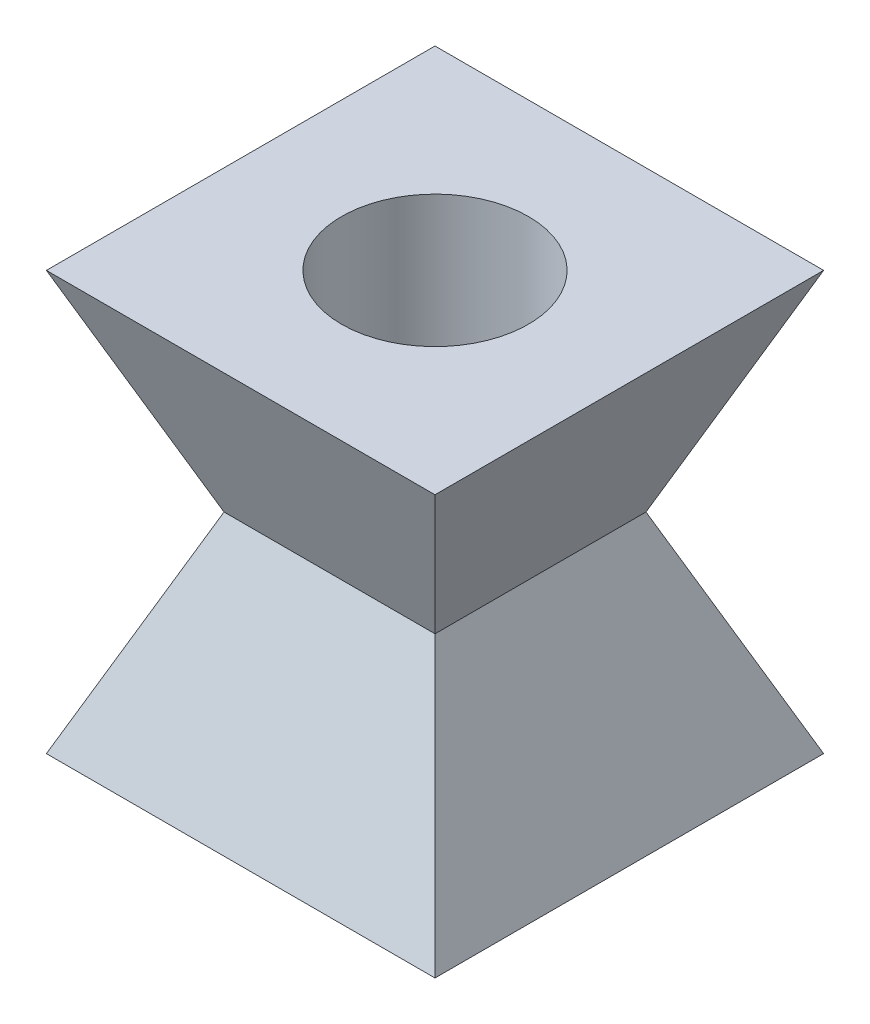
ISO-10303-21;
HEADER;
FILE_DESCRIPTION(('STEP AP214'),'2;1');
FILE_NAME('part.step','',(''),(''),'','','');
FILE_SCHEMA(('AUTOMOTIVE_DESIGN { 1 0 10303 214 1 1 1 1 }'));
ENDSEC;
DATA;
#1=APPLICATION_CONTEXT('core data for automotive mechanical design processes');
#2=APPLICATION_PROTOCOL_DEFINITION('international standard','automotive_design',2000,#1);
#3=PRODUCT_CONTEXT('',#1,'mechanical');
#4=PRODUCT('Part','Part','',(#3));
#5=PRODUCT_RELATED_PRODUCT_CATEGORY('part','',(#4));
#6=PRODUCT_DEFINITION_FORMATION('','',#4);
#7=PRODUCT_DEFINITION_CONTEXT('part definition',#1,'design');
#8=PRODUCT_DEFINITION('design','',#6,#7);
#9=PRODUCT_DEFINITION_SHAPE('','',#8);
#10=(LENGTH_UNIT() NAMED_UNIT(*) SI_UNIT(.MILLI.,.METRE.));
#11=(NAMED_UNIT(*) PLANE_ANGLE_UNIT() SI_UNIT($,.RADIAN.));
#12=(NAMED_UNIT(*) SI_UNIT($,.STERADIAN.) SOLID_ANGLE_UNIT());
#13=UNCERTAINTY_MEASURE_WITH_UNIT(LENGTH_MEASURE(1.E-05),#10,'distance_accuracy_value','');
#14=(GEOMETRIC_REPRESENTATION_CONTEXT(3) GLOBAL_UNCERTAINTY_ASSIGNED_CONTEXT((#13)) GLOBAL_UNIT_ASSIGNED_CONTEXT((#10,
#11,#12)) REPRESENTATION_CONTEXT('',''));
#15=CARTESIAN_POINT('',(0.,0.,0.));
#16=DIRECTION('',(0.,0.,1.));
#17=DIRECTION('',(1.,0.,0.));
#18=AXIS2_PLACEMENT_3D('',#15,#16,#17);
#19=CARTESIAN_POINT('',(52.,0.,-52.));
#20=DIRECTION('',(0.92050485345244,-0.390731128489275,0.));
#21=DIRECTION('',(0.390731128489275,0.92050485345244,0.));
#22=AXIS2_PLACEMENT_3D('',#19,#20,#21);
#23=PLANE('',#22);
#24=DIRECTION('',(0.,0.,-1.));
#25=VECTOR('',#24,1.);
#26=CARTESIAN_POINT('',(52.,0.,-52.));
#27=LINE('',#26,#25);
#28=CARTESIAN_POINT('',(52.,0.,52.));
#29=VERTEX_POINT('',#28);
#30=CARTESIAN_POINT('',(52.,0.,-52.));
#31=VERTEX_POINT('',#30);
#32=EDGE_CURVE('E140',#29,#31,#27,.T.);
#33=ORIENTED_EDGE('',*,*,#32,.F.);
#34=DIRECTION('',(0.363936289648103,0.8573801689766,0.363936289648103));
#35=VECTOR('',#34,1.);
#36=CARTESIAN_POINT('',(38.2252392160259,-32.4513027815816,38.2252392160258));
#37=LINE('',#36,#35);
#38=CARTESIAN_POINT('',(28.2294102922621,-56.,28.229410292262));
#39=VERTEX_POINT('',#38);
#40=EDGE_CURVE('E11',#39,#29,#37,.T.);
#41=ORIENTED_EDGE('',*,*,#40,.F.);
#42=DIRECTION('',(0.,0.,-1.));
#43=VECTOR('',#42,1.);
#44=CARTESIAN_POINT('',(28.2294102922621,-56.,0.));
#45=LINE('',#44,#43);
#46=CARTESIAN_POINT('',(28.229410292262,-56.,-28.2294102922621));
#47=VERTEX_POINT('',#46);
#48=EDGE_CURVE('E119',#39,#47,#45,.T.);
#49=ORIENTED_EDGE('',*,*,#48,.T.);
#50=DIRECTION('',(0.363936289648103,0.8573801689766,-0.363936289648103));
#51=VECTOR('',#50,1.);
#52=CARTESIAN_POINT('',(52.,0.,-52.));
#53=LINE('',#52,#51);
#54=EDGE_CURVE('E162',#47,#31,#53,.T.);
#55=ORIENTED_EDGE('',*,*,#54,.T.);
#56=EDGE_LOOP('',(#33,#41,#49,#55));
#57=FACE_BOUND('',#56,.T.);
#58=ADVANCED_FACE('F43',(#57),#23,.T.);
#59=CARTESIAN_POINT('',(-52.,0.,52.));
#60=DIRECTION('',(0.,-0.390731128489275,0.92050485345244));
#61=DIRECTION('',(0.,-0.92050485345244,-0.390731128489275));
#62=AXIS2_PLACEMENT_3D('',#59,#60,#61);
#63=PLANE('',#62);
#64=DIRECTION('',(1.,0.,0.));
#65=VECTOR('',#64,1.);
#66=CARTESIAN_POINT('',(-52.,0.,52.));
#67=LINE('',#66,#65);
#68=CARTESIAN_POINT('',(-52.,0.,52.));
#69=VERTEX_POINT('',#68);
#70=EDGE_CURVE('E158',#69,#29,#67,.T.);
#71=ORIENTED_EDGE('',*,*,#70,.F.);
#72=DIRECTION('',(-0.363936289648103,0.8573801689766,0.363936289648103));
#73=VECTOR('',#72,1.);
#74=CARTESIAN_POINT('',(-38.2252392160259,-32.4513027815816,38.2252392160259));
#75=LINE('',#74,#73);
#76=CARTESIAN_POINT('',(-28.2294102922621,-56.,28.229410292262));
#77=VERTEX_POINT('',#76);
#78=EDGE_CURVE('E53',#77,#69,#75,.T.);
#79=ORIENTED_EDGE('',*,*,#78,.F.);
#80=DIRECTION('',(1.,0.,0.));
#81=VECTOR('',#80,1.);
#82=CARTESIAN_POINT('',(0.,-56.,28.229410292262));
#83=LINE('',#82,#81);
#84=EDGE_CURVE('E166',#77,#39,#83,.T.);
#85=ORIENTED_EDGE('',*,*,#84,.T.);
#86=ORIENTED_EDGE('',*,*,#40,.T.);
#87=EDGE_LOOP('',(#71,#79,#85,#86));
#88=FACE_BOUND('',#87,.T.);
#89=ADVANCED_FACE('F45',(#88),#63,.T.);
#90=CARTESIAN_POINT('',(-52.,0.,-52.));
#91=DIRECTION('',(-0.92050485345244,-0.390731128489275,0.));
#92=DIRECTION('',(0.390731128489275,-0.92050485345244,0.));
#93=AXIS2_PLACEMENT_3D('',#90,#91,#92);
#94=PLANE('',#93);
#95=DIRECTION('',(0.,0.,1.));
#96=VECTOR('',#95,1.);
#97=CARTESIAN_POINT('',(-52.,0.,-52.));
#98=LINE('',#97,#96);
#99=CARTESIAN_POINT('',(-52.,0.,-52.));
#100=VERTEX_POINT('',#99);
#101=EDGE_CURVE('E154',#100,#69,#98,.T.);
#102=ORIENTED_EDGE('',*,*,#101,.F.);
#103=DIRECTION('',(-0.363936289648103,0.8573801689766,-0.363936289648103));
#104=VECTOR('',#103,1.);
#105=CARTESIAN_POINT('',(-52.,0.,-52.));
#106=LINE('',#105,#104);
#107=CARTESIAN_POINT('',(-28.2294102922621,-56.,-28.2294102922621));
#108=VERTEX_POINT('',#107);
#109=EDGE_CURVE('E165',#108,#100,#106,.T.);
#110=ORIENTED_EDGE('',*,*,#109,.F.);
#111=DIRECTION('',(0.,0.,1.));
#112=VECTOR('',#111,1.);
#113=CARTESIAN_POINT('',(-28.2294102922621,-56.,0.));
#114=LINE('',#113,#112);
#115=EDGE_CURVE('E61',#108,#77,#114,.T.);
#116=ORIENTED_EDGE('',*,*,#115,.T.);
#117=ORIENTED_EDGE('',*,*,#78,.T.);
#118=EDGE_LOOP('',(#102,#110,#116,#117));
#119=FACE_BOUND('',#118,.T.);
#120=ADVANCED_FACE('F186',(#119),#94,.T.);
#121=CARTESIAN_POINT('',(-52.,0.,-52.));
#122=DIRECTION('',(0.,-0.390731128489275,-0.92050485345244));
#123=DIRECTION('',(0.,0.92050485345244,-0.390731128489275));
#124=AXIS2_PLACEMENT_3D('',#121,#122,#123);
#125=PLANE('',#124);
#126=DIRECTION('',(-1.,0.,0.));
#127=VECTOR('',#126,1.);
#128=CARTESIAN_POINT('',(-52.,0.,-52.));
#129=LINE('',#128,#127);
#130=EDGE_CURVE('E150',#31,#100,#129,.T.);
#131=ORIENTED_EDGE('',*,*,#130,.F.);
#132=ORIENTED_EDGE('',*,*,#54,.F.);
#133=DIRECTION('',(-1.,0.,0.));
#134=VECTOR('',#133,1.);
#135=CARTESIAN_POINT('',(0.,-56.,-28.2294102922621));
#136=LINE('',#135,#134);
#137=EDGE_CURVE('E47',#47,#108,#136,.T.);
#138=ORIENTED_EDGE('',*,*,#137,.T.);
#139=ORIENTED_EDGE('',*,*,#109,.T.);
#140=EDGE_LOOP('',(#131,#132,#138,#139));
#141=FACE_BOUND('',#140,.T.);
#142=ADVANCED_FACE('F182',(#141),#125,.T.);
#143=CARTESIAN_POINT('',(0.,0.,0.));
#144=DIRECTION('',(0.,1.,0.));
#145=DIRECTION('',(0.,0.,1.));
#146=AXIS2_PLACEMENT_3D('',#143,#144,#145);
#147=PLANE('',#146);
#148=CARTESIAN_POINT('',(0.,0.,0.));
#149=DIRECTION('',(0.,1.,0.));
#150=DIRECTION('',(0.,0.,1.));
#151=AXIS2_PLACEMENT_3D('',#148,#149,#150);
#152=CIRCLE('',#151,25.);
#153=CARTESIAN_POINT('',(0.,0.,25.));
#154=VERTEX_POINT('',#153);
#155=EDGE_CURVE('E126',#154,#154,#152,.T.);
#156=ORIENTED_EDGE('',*,*,#155,.F.);
#157=EDGE_LOOP('',(#156));
#158=FACE_BOUND('',#157,.T.);
#159=ORIENTED_EDGE('',*,*,#32,.T.);
#160=ORIENTED_EDGE('',*,*,#130,.T.);
#161=ORIENTED_EDGE('',*,*,#101,.T.);
#162=ORIENTED_EDGE('',*,*,#70,.T.);
#163=EDGE_LOOP('',(#159,#160,#161,#162));
#164=FACE_BOUND('',#163,.T.);
#165=ADVANCED_FACE('F189',(#158,#164),#147,.T.);
#166=CARTESIAN_POINT('',(52.,-112.,-52.));
#167=DIRECTION('',(0.92050485345244,0.390731128489275,0.));
#168=DIRECTION('',(-0.390731128489275,0.92050485345244,0.));
#169=AXIS2_PLACEMENT_3D('',#166,#167,#168);
#170=PLANE('',#169);
#171=DIRECTION('',(0.,0.,-1.));
#172=VECTOR('',#171,1.);
#173=CARTESIAN_POINT('',(52.,-112.,-52.));
#174=LINE('',#173,#172);
#175=CARTESIAN_POINT('',(52.,-112.,52.));
#176=VERTEX_POINT('',#175);
#177=CARTESIAN_POINT('',(52.,-112.,-52.));
#178=VERTEX_POINT('',#177);
#179=EDGE_CURVE('E112',#176,#178,#174,.T.);
#180=ORIENTED_EDGE('',*,*,#179,.T.);
#181=DIRECTION('',(0.363936289648103,-0.8573801689766,-0.363936289648103));
#182=VECTOR('',#181,1.);
#183=CARTESIAN_POINT('',(38.2252392160259,-79.5486972184184,-38.2252392160259));
#184=LINE('',#183,#182);
#185=EDGE_CURVE('E138',#47,#178,#184,.T.);
#186=ORIENTED_EDGE('',*,*,#185,.F.);
#187=ORIENTED_EDGE('',*,*,#48,.F.);
#188=DIRECTION('',(0.363936289648103,-0.8573801689766,0.363936289648103));
#189=VECTOR('',#188,1.);
#190=CARTESIAN_POINT('',(38.2252392160259,-79.5486972184184,38.2252392160258));
#191=LINE('',#190,#189);
#192=EDGE_CURVE('E104',#39,#176,#191,.T.);
#193=ORIENTED_EDGE('',*,*,#192,.T.);
#194=EDGE_LOOP('',(#180,#186,#187,#193));
#195=FACE_BOUND('',#194,.T.);
#196=ADVANCED_FACE('F116',(#195),#170,.T.);
#197=CARTESIAN_POINT('',(-52.,-112.,-52.));
#198=DIRECTION('',(0.,0.390731128489275,-0.92050485345244));
#199=DIRECTION('',(0.,0.92050485345244,0.390731128489275));
#200=AXIS2_PLACEMENT_3D('',#197,#198,#199);
#201=PLANE('',#200);
#202=DIRECTION('',(-1.,0.,0.));
#203=VECTOR('',#202,1.);
#204=CARTESIAN_POINT('',(-52.,-112.,-52.));
#205=LINE('',#204,#203);
#206=CARTESIAN_POINT('',(-52.,-112.,-52.));
#207=VERTEX_POINT('',#206);
#208=EDGE_CURVE('E121',#178,#207,#205,.T.);
#209=ORIENTED_EDGE('',*,*,#208,.T.);
#210=DIRECTION('',(-0.363936289648103,-0.8573801689766,-0.363936289648103));
#211=VECTOR('',#210,1.);
#212=CARTESIAN_POINT('',(-52.,-112.,-52.));
#213=LINE('',#212,#211);
#214=EDGE_CURVE('E141',#108,#207,#213,.T.);
#215=ORIENTED_EDGE('',*,*,#214,.F.);
#216=ORIENTED_EDGE('',*,*,#137,.F.);
#217=ORIENTED_EDGE('',*,*,#185,.T.);
#218=EDGE_LOOP('',(#209,#215,#216,#217));
#219=FACE_BOUND('',#218,.T.);
#220=ADVANCED_FACE('F185',(#219),#201,.T.);
#221=CARTESIAN_POINT('',(-52.,-112.,-52.));
#222=DIRECTION('',(-0.92050485345244,0.390731128489275,0.));
#223=DIRECTION('',(-0.390731128489275,-0.92050485345244,0.));
#224=AXIS2_PLACEMENT_3D('',#221,#222,#223);
#225=PLANE('',#224);
#226=DIRECTION('',(0.,0.,1.));
#227=VECTOR('',#226,1.);
#228=CARTESIAN_POINT('',(-52.,-112.,-52.));
#229=LINE('',#228,#227);
#230=CARTESIAN_POINT('',(-52.,-112.,52.));
#231=VERTEX_POINT('',#230);
#232=EDGE_CURVE('E111',#207,#231,#229,.T.);
#233=ORIENTED_EDGE('',*,*,#232,.T.);
#234=DIRECTION('',(-0.363936289648103,-0.8573801689766,0.363936289648103));
#235=VECTOR('',#234,1.);
#236=CARTESIAN_POINT('',(-52.,-112.,52.));
#237=LINE('',#236,#235);
#238=EDGE_CURVE('E106',#77,#231,#237,.T.);
#239=ORIENTED_EDGE('',*,*,#238,.F.);
#240=ORIENTED_EDGE('',*,*,#115,.F.);
#241=ORIENTED_EDGE('',*,*,#214,.T.);
#242=EDGE_LOOP('',(#233,#239,#240,#241));
#243=FACE_BOUND('',#242,.T.);
#244=ADVANCED_FACE('F226',(#243),#225,.T.);
#245=CARTESIAN_POINT('',(-52.,-112.,52.));
#246=DIRECTION('',(0.,0.390731128489275,0.92050485345244));
#247=DIRECTION('',(0.,-0.92050485345244,0.390731128489275));
#248=AXIS2_PLACEMENT_3D('',#245,#246,#247);
#249=PLANE('',#248);
#250=DIRECTION('',(1.,0.,0.));
#251=VECTOR('',#250,1.);
#252=CARTESIAN_POINT('',(-52.,-112.,52.));
#253=LINE('',#252,#251);
#254=EDGE_CURVE('E100',#231,#176,#253,.T.);
#255=ORIENTED_EDGE('',*,*,#254,.T.);
#256=ORIENTED_EDGE('',*,*,#192,.F.);
#257=ORIENTED_EDGE('',*,*,#84,.F.);
#258=ORIENTED_EDGE('',*,*,#238,.T.);
#259=EDGE_LOOP('',(#255,#256,#257,#258));
#260=FACE_BOUND('',#259,.T.);
#261=ADVANCED_FACE('F102',(#260),#249,.T.);
#262=CARTESIAN_POINT('',(0.,-112.,0.));
#263=DIRECTION('',(0.,-1.,0.));
#264=DIRECTION('',(0.,0.,1.));
#265=AXIS2_PLACEMENT_3D('',#262,#263,#264);
#266=PLANE('',#265);
#267=CARTESIAN_POINT('',(0.,-112.,0.));
#268=DIRECTION('',(0.,1.,0.));
#269=DIRECTION('',(0.,0.,1.));
#270=AXIS2_PLACEMENT_3D('',#267,#268,#269);
#271=CIRCLE('',#270,25.);
#272=CARTESIAN_POINT('',(0.,-112.,25.));
#273=VERTEX_POINT('',#272);
#274=EDGE_CURVE('E130',#273,#273,#271,.T.);
#275=ORIENTED_EDGE('',*,*,#274,.T.);
#276=EDGE_LOOP('',(#275));
#277=FACE_BOUND('',#276,.T.);
#278=ORIENTED_EDGE('',*,*,#179,.F.);
#279=ORIENTED_EDGE('',*,*,#254,.F.);
#280=ORIENTED_EDGE('',*,*,#232,.F.);
#281=ORIENTED_EDGE('',*,*,#208,.F.);
#282=EDGE_LOOP('',(#278,#279,#280,#281));
#283=FACE_BOUND('',#282,.T.);
#284=ADVANCED_FACE('F123',(#277,#283),#266,.T.);
#285=CARTESIAN_POINT('',(0.,-112.,0.));
#286=DIRECTION('',(0.,1.,0.));
#287=DIRECTION('',(0.,0.,1.));
#288=AXIS2_PLACEMENT_3D('',#285,#286,#287);
#289=CYLINDRICAL_SURFACE('',#288,25.);
#290=ORIENTED_EDGE('',*,*,#155,.T.);
#291=EDGE_LOOP('',(#290));
#292=FACE_BOUND('',#291,.T.);
#293=ORIENTED_EDGE('',*,*,#274,.F.);
#294=EDGE_LOOP('',(#293));
#295=FACE_BOUND('',#294,.T.);
#296=ADVANCED_FACE('F213',(#292,#295),#289,.F.);
#297=CLOSED_SHELL('',(#58,#89,#120,#142,#165,#196,#220,#244,#261,#284,#296));
#298=MANIFOLD_SOLID_BREP('B2',#297);
#299=ADVANCED_BREP_SHAPE_REPRESENTATION('',(#18,#298),#14);
#300=SHAPE_DEFINITION_REPRESENTATION(#9,#299);
ENDSEC;
END-ISO-10303-21;
